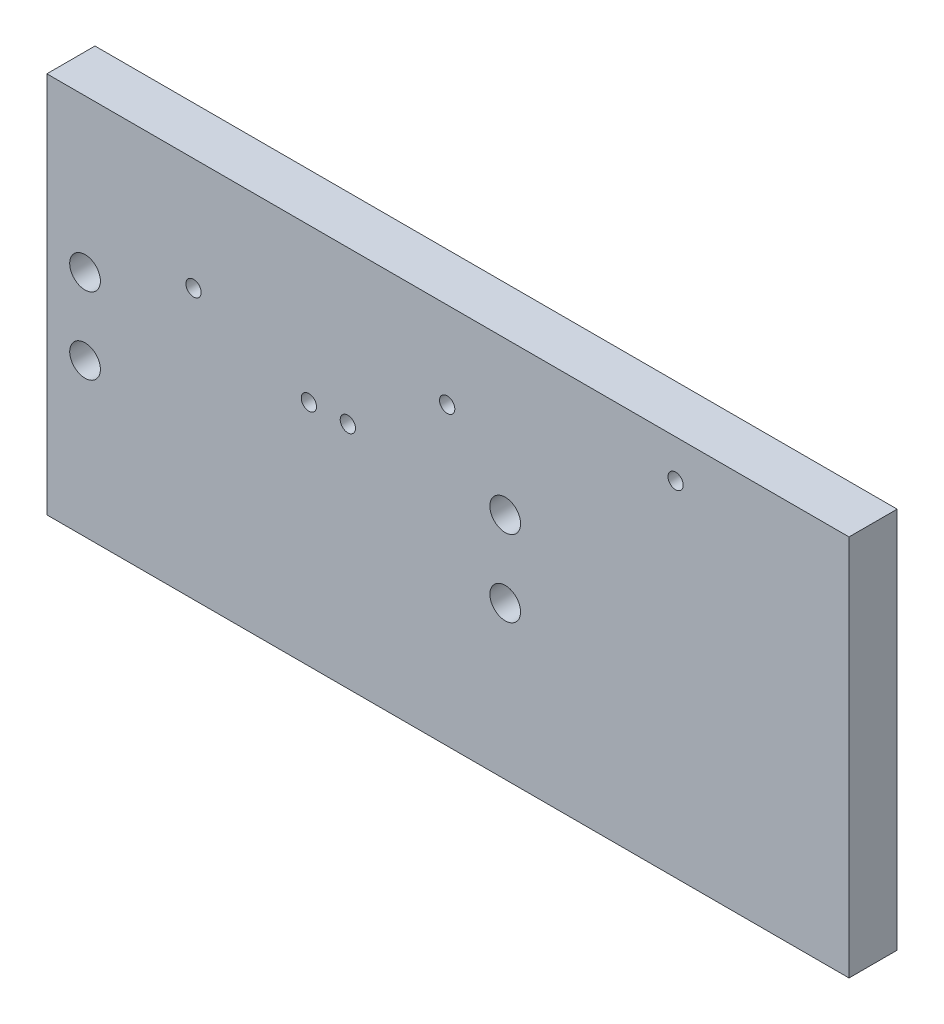
ISO-10303-21;
HEADER;
FILE_DESCRIPTION(('STEP AP214'),'2;1');
FILE_NAME('part.step','',(''),(''),'','','');
FILE_SCHEMA(('AUTOMOTIVE_DESIGN { 1 0 10303 214 1 1 1 1 }'));
ENDSEC;
DATA;
#1=APPLICATION_CONTEXT('core data for automotive mechanical design processes');
#2=APPLICATION_PROTOCOL_DEFINITION('international standard','automotive_design',2000,#1);
#3=PRODUCT_CONTEXT('',#1,'mechanical');
#4=PRODUCT('Part','Part','',(#3));
#5=PRODUCT_RELATED_PRODUCT_CATEGORY('part','',(#4));
#6=PRODUCT_DEFINITION_FORMATION('','',#4);
#7=PRODUCT_DEFINITION_CONTEXT('part definition',#1,'design');
#8=PRODUCT_DEFINITION('design','',#6,#7);
#9=PRODUCT_DEFINITION_SHAPE('','',#8);
#10=(LENGTH_UNIT() NAMED_UNIT(*) SI_UNIT(.MILLI.,.METRE.));
#11=(NAMED_UNIT(*) PLANE_ANGLE_UNIT() SI_UNIT($,.RADIAN.));
#12=(NAMED_UNIT(*) SI_UNIT($,.STERADIAN.) SOLID_ANGLE_UNIT());
#13=UNCERTAINTY_MEASURE_WITH_UNIT(LENGTH_MEASURE(1.E-05),#10,'distance_accuracy_value','');
#14=(GEOMETRIC_REPRESENTATION_CONTEXT(3) GLOBAL_UNCERTAINTY_ASSIGNED_CONTEXT((#13)) GLOBAL_UNIT_ASSIGNED_CONTEXT((#10,
#11,#12)) REPRESENTATION_CONTEXT('',''));
#15=CARTESIAN_POINT('',(0.,0.,0.));
#16=DIRECTION('',(0.,0.,1.));
#17=DIRECTION('',(1.,0.,0.));
#18=AXIS2_PLACEMENT_3D('',#15,#16,#17);
#19=CARTESIAN_POINT('',(0.,0.,1.6));
#20=DIRECTION('',(0.,0.,1.));
#21=DIRECTION('',(1.,0.,0.));
#22=AXIS2_PLACEMENT_3D('',#19,#20,#21);
#23=PLANE('',#22);
#24=CARTESIAN_POINT('',(15.24,7.62,1.6));
#25=DIRECTION('',(0.,0.,1.));
#26=DIRECTION('',(1.,0.,0.));
#27=AXIS2_PLACEMENT_3D('',#24,#25,#26);
#28=CIRCLE('',#27,0.51);
#29=CARTESIAN_POINT('',(15.75,7.62,1.6));
#30=VERTEX_POINT('',#29);
#31=EDGE_CURVE('E150',#30,#30,#28,.T.);
#32=ORIENTED_EDGE('',*,*,#31,.F.);
#33=EDGE_LOOP('',(#32));
#34=FACE_BOUND('',#33,.T.);
#35=CARTESIAN_POINT('',(1.27,7.62,1.6));
#36=DIRECTION('',(0.,0.,1.));
#37=DIRECTION('',(1.,0.,0.));
#38=AXIS2_PLACEMENT_3D('',#35,#36,#37);
#39=CIRCLE('',#38,0.51);
#40=CARTESIAN_POINT('',(1.78,7.62,1.6));
#41=VERTEX_POINT('',#40);
#42=EDGE_CURVE('E138',#41,#41,#39,.T.);
#43=ORIENTED_EDGE('',*,*,#42,.F.);
#44=EDGE_LOOP('',(#43));
#45=FACE_BOUND('',#44,.T.);
#46=CARTESIAN_POINT('',(20.9042,11.43,1.6));
#47=DIRECTION('',(0.,0.,1.));
#48=DIRECTION('',(1.,0.,0.));
#49=AXIS2_PLACEMENT_3D('',#46,#47,#48);
#50=CIRCLE('',#49,0.254000000000001);
#51=CARTESIAN_POINT('',(21.1582,11.43,1.6));
#52=VERTEX_POINT('',#51);
#53=EDGE_CURVE('E126',#52,#52,#50,.T.);
#54=ORIENTED_EDGE('',*,*,#53,.F.);
#55=EDGE_LOOP('',(#54));
#56=FACE_BOUND('',#55,.T.);
#57=CARTESIAN_POINT('',(10.0076,7.62,1.6));
#58=DIRECTION('',(0.,0.,1.));
#59=DIRECTION('',(1.,0.,0.));
#60=AXIS2_PLACEMENT_3D('',#57,#58,#59);
#61=CIRCLE('',#60,0.254000000000001);
#62=CARTESIAN_POINT('',(10.2616,7.62,1.6));
#63=VERTEX_POINT('',#62);
#64=EDGE_CURVE('E114',#63,#63,#61,.T.);
#65=ORIENTED_EDGE('',*,*,#64,.F.);
#66=EDGE_LOOP('',(#65));
#67=FACE_BOUND('',#66,.T.);
#68=DIRECTION('',(0.,-1.,0.));
#69=VECTOR('',#68,1.);
#70=CARTESIAN_POINT('',(0.,12.7,1.6));
#71=LINE('',#70,#69);
#72=CARTESIAN_POINT('',(0.,12.7,1.6));
#73=VERTEX_POINT('',#72);
#74=CARTESIAN_POINT('',(0.,0.,1.6));
#75=VERTEX_POINT('',#74);
#76=EDGE_CURVE('E84',#73,#75,#71,.T.);
#77=ORIENTED_EDGE('',*,*,#76,.T.);
#78=DIRECTION('',(1.,0.,0.));
#79=VECTOR('',#78,1.);
#80=CARTESIAN_POINT('',(0.,0.,1.6));
#81=LINE('',#80,#79);
#82=CARTESIAN_POINT('',(26.67,0.,1.6));
#83=VERTEX_POINT('',#82);
#84=EDGE_CURVE('E79',#75,#83,#81,.T.);
#85=ORIENTED_EDGE('',*,*,#84,.T.);
#86=DIRECTION('',(0.,1.,0.));
#87=VECTOR('',#86,1.);
#88=CARTESIAN_POINT('',(26.67,0.,1.6));
#89=LINE('',#88,#87);
#90=CARTESIAN_POINT('',(26.67,12.7,1.6));
#91=VERTEX_POINT('',#90);
#92=EDGE_CURVE('E82',#83,#91,#89,.T.);
#93=ORIENTED_EDGE('',*,*,#92,.T.);
#94=DIRECTION('',(-1.,0.,0.));
#95=VECTOR('',#94,1.);
#96=CARTESIAN_POINT('',(26.67,12.7,1.6));
#97=LINE('',#96,#95);
#98=EDGE_CURVE('E49',#91,#73,#97,.T.);
#99=ORIENTED_EDGE('',*,*,#98,.T.);
#100=EDGE_LOOP('',(#77,#85,#93,#99));
#101=FACE_BOUND('',#100,.T.);
#102=CARTESIAN_POINT('',(8.7122,7.5946,1.6));
#103=DIRECTION('',(0.,0.,1.));
#104=DIRECTION('',(1.,0.,0.));
#105=AXIS2_PLACEMENT_3D('',#102,#103,#104);
#106=CIRCLE('',#105,0.254000000000001);
#107=CARTESIAN_POINT('',(8.9662,7.5946,1.6));
#108=VERTEX_POINT('',#107);
#109=EDGE_CURVE('E99',#108,#108,#106,.T.);
#110=ORIENTED_EDGE('',*,*,#109,.F.);
#111=EDGE_LOOP('',(#110));
#112=FACE_BOUND('',#111,.T.);
#113=CARTESIAN_POINT('',(13.3096,9.8298,1.6));
#114=DIRECTION('',(0.,0.,1.));
#115=DIRECTION('',(1.,0.,0.));
#116=AXIS2_PLACEMENT_3D('',#113,#114,#115);
#117=CIRCLE('',#116,0.254000000000001);
#118=CARTESIAN_POINT('',(13.5636,9.8298,1.6));
#119=VERTEX_POINT('',#118);
#120=EDGE_CURVE('E120',#119,#119,#117,.T.);
#121=ORIENTED_EDGE('',*,*,#120,.F.);
#122=EDGE_LOOP('',(#121));
#123=FACE_BOUND('',#122,.T.);
#124=CARTESIAN_POINT('',(4.8768,8.9662,1.6));
#125=DIRECTION('',(0.,0.,1.));
#126=DIRECTION('',(1.,0.,0.));
#127=AXIS2_PLACEMENT_3D('',#124,#125,#126);
#128=CIRCLE('',#127,0.254);
#129=CARTESIAN_POINT('',(5.1308,8.9662,1.6));
#130=VERTEX_POINT('',#129);
#131=EDGE_CURVE('E132',#130,#130,#128,.T.);
#132=ORIENTED_EDGE('',*,*,#131,.F.);
#133=EDGE_LOOP('',(#132));
#134=FACE_BOUND('',#133,.T.);
#135=CARTESIAN_POINT('',(1.27,5.08,1.6));
#136=DIRECTION('',(0.,0.,1.));
#137=DIRECTION('',(1.,0.,0.));
#138=AXIS2_PLACEMENT_3D('',#135,#136,#137);
#139=CIRCLE('',#138,0.51);
#140=CARTESIAN_POINT('',(1.78,5.08,1.6));
#141=VERTEX_POINT('',#140);
#142=EDGE_CURVE('E144',#141,#141,#139,.T.);
#143=ORIENTED_EDGE('',*,*,#142,.F.);
#144=EDGE_LOOP('',(#143));
#145=FACE_BOUND('',#144,.T.);
#146=CARTESIAN_POINT('',(15.24,5.08,1.6));
#147=DIRECTION('',(0.,0.,1.));
#148=DIRECTION('',(1.,0.,0.));
#149=AXIS2_PLACEMENT_3D('',#146,#147,#148);
#150=CIRCLE('',#149,0.51);
#151=CARTESIAN_POINT('',(15.75,5.08,1.6));
#152=VERTEX_POINT('',#151);
#153=EDGE_CURVE('E156',#152,#152,#150,.T.);
#154=ORIENTED_EDGE('',*,*,#153,.F.);
#155=EDGE_LOOP('',(#154));
#156=FACE_BOUND('',#155,.T.);
#157=ADVANCED_FACE('F32',(#34,#45,#56,#67,#101,#112,#123,#134,#145,#156),#23,.T.);
#158=CARTESIAN_POINT('',(0.,0.,0.));
#159=DIRECTION('',(0.,0.,1.));
#160=DIRECTION('',(1.,0.,0.));
#161=AXIS2_PLACEMENT_3D('',#158,#159,#160);
#162=PLANE('',#161);
#163=CARTESIAN_POINT('',(15.24,7.62,0.));
#164=DIRECTION('',(0.,0.,1.));
#165=DIRECTION('',(1.,0.,0.));
#166=AXIS2_PLACEMENT_3D('',#163,#164,#165);
#167=CIRCLE('',#166,0.51);
#168=CARTESIAN_POINT('',(15.75,7.62,0.));
#169=VERTEX_POINT('',#168);
#170=EDGE_CURVE('E153',#169,#169,#167,.T.);
#171=ORIENTED_EDGE('',*,*,#170,.T.);
#172=EDGE_LOOP('',(#171));
#173=FACE_BOUND('',#172,.T.);
#174=CARTESIAN_POINT('',(1.27,7.62,0.));
#175=DIRECTION('',(0.,0.,1.));
#176=DIRECTION('',(1.,0.,0.));
#177=AXIS2_PLACEMENT_3D('',#174,#175,#176);
#178=CIRCLE('',#177,0.51);
#179=CARTESIAN_POINT('',(1.78,7.62,0.));
#180=VERTEX_POINT('',#179);
#181=EDGE_CURVE('E141',#180,#180,#178,.T.);
#182=ORIENTED_EDGE('',*,*,#181,.T.);
#183=EDGE_LOOP('',(#182));
#184=FACE_BOUND('',#183,.T.);
#185=CARTESIAN_POINT('',(20.9042,11.43,0.));
#186=DIRECTION('',(0.,0.,1.));
#187=DIRECTION('',(1.,0.,0.));
#188=AXIS2_PLACEMENT_3D('',#185,#186,#187);
#189=CIRCLE('',#188,0.254000000000001);
#190=CARTESIAN_POINT('',(21.1582,11.43,0.));
#191=VERTEX_POINT('',#190);
#192=EDGE_CURVE('E129',#191,#191,#189,.T.);
#193=ORIENTED_EDGE('',*,*,#192,.T.);
#194=EDGE_LOOP('',(#193));
#195=FACE_BOUND('',#194,.T.);
#196=CARTESIAN_POINT('',(10.0076,7.62,0.));
#197=DIRECTION('',(0.,0.,1.));
#198=DIRECTION('',(1.,0.,0.));
#199=AXIS2_PLACEMENT_3D('',#196,#197,#198);
#200=CIRCLE('',#199,0.254000000000001);
#201=CARTESIAN_POINT('',(10.2616,7.62,0.));
#202=VERTEX_POINT('',#201);
#203=EDGE_CURVE('E117',#202,#202,#200,.T.);
#204=ORIENTED_EDGE('',*,*,#203,.T.);
#205=EDGE_LOOP('',(#204));
#206=FACE_BOUND('',#205,.T.);
#207=DIRECTION('',(0.,-1.,0.));
#208=VECTOR('',#207,1.);
#209=CARTESIAN_POINT('',(0.,12.7,0.));
#210=LINE('',#209,#208);
#211=CARTESIAN_POINT('',(0.,12.7,0.));
#212=VERTEX_POINT('',#211);
#213=CARTESIAN_POINT('',(0.,0.,0.));
#214=VERTEX_POINT('',#213);
#215=EDGE_CURVE('E96',#212,#214,#210,.T.);
#216=ORIENTED_EDGE('',*,*,#215,.F.);
#217=DIRECTION('',(-1.,0.,0.));
#218=VECTOR('',#217,1.);
#219=CARTESIAN_POINT('',(26.67,12.7,0.));
#220=LINE('',#219,#218);
#221=CARTESIAN_POINT('',(26.67,12.7,0.));
#222=VERTEX_POINT('',#221);
#223=EDGE_CURVE('E72',#222,#212,#220,.T.);
#224=ORIENTED_EDGE('',*,*,#223,.F.);
#225=DIRECTION('',(0.,1.,0.));
#226=VECTOR('',#225,1.);
#227=CARTESIAN_POINT('',(26.67,0.,0.));
#228=LINE('',#227,#226);
#229=CARTESIAN_POINT('',(26.67,0.,0.));
#230=VERTEX_POINT('',#229);
#231=EDGE_CURVE('E66',#230,#222,#228,.T.);
#232=ORIENTED_EDGE('',*,*,#231,.F.);
#233=DIRECTION('',(1.,0.,0.));
#234=VECTOR('',#233,1.);
#235=CARTESIAN_POINT('',(0.,0.,0.));
#236=LINE('',#235,#234);
#237=EDGE_CURVE('E88',#214,#230,#236,.T.);
#238=ORIENTED_EDGE('',*,*,#237,.F.);
#239=EDGE_LOOP('',(#216,#224,#232,#238));
#240=FACE_BOUND('',#239,.T.);
#241=CARTESIAN_POINT('',(8.7122,7.5946,0.));
#242=DIRECTION('',(0.,0.,1.));
#243=DIRECTION('',(1.,0.,0.));
#244=AXIS2_PLACEMENT_3D('',#241,#242,#243);
#245=CIRCLE('',#244,0.254000000000001);
#246=CARTESIAN_POINT('',(8.9662,7.5946,0.));
#247=VERTEX_POINT('',#246);
#248=EDGE_CURVE('E111',#247,#247,#245,.T.);
#249=ORIENTED_EDGE('',*,*,#248,.T.);
#250=EDGE_LOOP('',(#249));
#251=FACE_BOUND('',#250,.T.);
#252=CARTESIAN_POINT('',(13.3096,9.8298,0.));
#253=DIRECTION('',(0.,0.,1.));
#254=DIRECTION('',(1.,0.,0.));
#255=AXIS2_PLACEMENT_3D('',#252,#253,#254);
#256=CIRCLE('',#255,0.254000000000001);
#257=CARTESIAN_POINT('',(13.5636,9.8298,0.));
#258=VERTEX_POINT('',#257);
#259=EDGE_CURVE('E123',#258,#258,#256,.T.);
#260=ORIENTED_EDGE('',*,*,#259,.T.);
#261=EDGE_LOOP('',(#260));
#262=FACE_BOUND('',#261,.T.);
#263=CARTESIAN_POINT('',(4.8768,8.9662,0.));
#264=DIRECTION('',(0.,0.,1.));
#265=DIRECTION('',(1.,0.,0.));
#266=AXIS2_PLACEMENT_3D('',#263,#264,#265);
#267=CIRCLE('',#266,0.254);
#268=CARTESIAN_POINT('',(5.1308,8.9662,0.));
#269=VERTEX_POINT('',#268);
#270=EDGE_CURVE('E135',#269,#269,#267,.T.);
#271=ORIENTED_EDGE('',*,*,#270,.T.);
#272=EDGE_LOOP('',(#271));
#273=FACE_BOUND('',#272,.T.);
#274=CARTESIAN_POINT('',(1.27,5.08,0.));
#275=DIRECTION('',(0.,0.,1.));
#276=DIRECTION('',(1.,0.,0.));
#277=AXIS2_PLACEMENT_3D('',#274,#275,#276);
#278=CIRCLE('',#277,0.51);
#279=CARTESIAN_POINT('',(1.78,5.08,0.));
#280=VERTEX_POINT('',#279);
#281=EDGE_CURVE('E147',#280,#280,#278,.T.);
#282=ORIENTED_EDGE('',*,*,#281,.T.);
#283=EDGE_LOOP('',(#282));
#284=FACE_BOUND('',#283,.T.);
#285=CARTESIAN_POINT('',(15.24,5.08,0.));
#286=DIRECTION('',(0.,0.,1.));
#287=DIRECTION('',(1.,0.,0.));
#288=AXIS2_PLACEMENT_3D('',#285,#286,#287);
#289=CIRCLE('',#288,0.51);
#290=CARTESIAN_POINT('',(15.75,5.08,0.));
#291=VERTEX_POINT('',#290);
#292=EDGE_CURVE('E159',#291,#291,#289,.T.);
#293=ORIENTED_EDGE('',*,*,#292,.T.);
#294=EDGE_LOOP('',(#293));
#295=FACE_BOUND('',#294,.T.);
#296=ADVANCED_FACE('F107',(#173,#184,#195,#206,#240,#251,#262,#273,#284,#295),#162,.F.);
#297=CARTESIAN_POINT('',(0.,12.7,1.6));
#298=DIRECTION('',(1.,0.,0.));
#299=DIRECTION('',(0.,0.,-1.));
#300=AXIS2_PLACEMENT_3D('',#297,#298,#299);
#301=PLANE('',#300);
#302=ORIENTED_EDGE('',*,*,#215,.T.);
#303=DIRECTION('',(0.,0.,-1.));
#304=VECTOR('',#303,1.);
#305=CARTESIAN_POINT('',(0.,0.,1.6));
#306=LINE('',#305,#304);
#307=EDGE_CURVE('E11',#75,#214,#306,.T.);
#308=ORIENTED_EDGE('',*,*,#307,.F.);
#309=ORIENTED_EDGE('',*,*,#76,.F.);
#310=DIRECTION('',(0.,0.,-1.));
#311=VECTOR('',#310,1.);
#312=CARTESIAN_POINT('',(0.,12.7,1.6));
#313=LINE('',#312,#311);
#314=EDGE_CURVE('E92',#73,#212,#313,.T.);
#315=ORIENTED_EDGE('',*,*,#314,.T.);
#316=EDGE_LOOP('',(#302,#308,#309,#315));
#317=FACE_BOUND('',#316,.T.);
#318=ADVANCED_FACE('F34',(#317),#301,.F.);
#319=CARTESIAN_POINT('',(0.,0.,1.6));
#320=DIRECTION('',(0.,1.,0.));
#321=DIRECTION('',(0.,0.,1.));
#322=AXIS2_PLACEMENT_3D('',#319,#320,#321);
#323=PLANE('',#322);
#324=ORIENTED_EDGE('',*,*,#237,.T.);
#325=DIRECTION('',(0.,0.,-1.));
#326=VECTOR('',#325,1.);
#327=CARTESIAN_POINT('',(26.67,0.,1.6));
#328=LINE('',#327,#326);
#329=EDGE_CURVE('E41',#83,#230,#328,.T.);
#330=ORIENTED_EDGE('',*,*,#329,.F.);
#331=ORIENTED_EDGE('',*,*,#84,.F.);
#332=ORIENTED_EDGE('',*,*,#307,.T.);
#333=EDGE_LOOP('',(#324,#330,#331,#332));
#334=FACE_BOUND('',#333,.T.);
#335=ADVANCED_FACE('F87',(#334),#323,.F.);
#336=CARTESIAN_POINT('',(26.67,0.,1.6));
#337=DIRECTION('',(-1.,0.,0.));
#338=DIRECTION('',(0.,0.,1.));
#339=AXIS2_PLACEMENT_3D('',#336,#337,#338);
#340=PLANE('',#339);
#341=ORIENTED_EDGE('',*,*,#231,.T.);
#342=DIRECTION('',(0.,0.,-1.));
#343=VECTOR('',#342,1.);
#344=CARTESIAN_POINT('',(26.67,12.7,1.6));
#345=LINE('',#344,#343);
#346=EDGE_CURVE('E89',#91,#222,#345,.T.);
#347=ORIENTED_EDGE('',*,*,#346,.F.);
#348=ORIENTED_EDGE('',*,*,#92,.F.);
#349=ORIENTED_EDGE('',*,*,#329,.T.);
#350=EDGE_LOOP('',(#341,#347,#348,#349));
#351=FACE_BOUND('',#350,.T.);
#352=ADVANCED_FACE('F90',(#351),#340,.F.);
#353=CARTESIAN_POINT('',(26.67,12.7,1.6));
#354=DIRECTION('',(0.,-1.,0.));
#355=DIRECTION('',(0.,0.,-1.));
#356=AXIS2_PLACEMENT_3D('',#353,#354,#355);
#357=PLANE('',#356);
#358=ORIENTED_EDGE('',*,*,#223,.T.);
#359=ORIENTED_EDGE('',*,*,#314,.F.);
#360=ORIENTED_EDGE('',*,*,#98,.F.);
#361=ORIENTED_EDGE('',*,*,#346,.T.);
#362=EDGE_LOOP('',(#358,#359,#360,#361));
#363=FACE_BOUND('',#362,.T.);
#364=ADVANCED_FACE('F104',(#363),#357,.F.);
#365=CARTESIAN_POINT('',(8.7122,7.5946,1.6));
#366=DIRECTION('',(0.,0.,-1.));
#367=DIRECTION('',(-1.,0.,0.));
#368=AXIS2_PLACEMENT_3D('',#365,#366,#367);
#369=CYLINDRICAL_SURFACE('',#368,0.254000000000001);
#370=ORIENTED_EDGE('',*,*,#109,.T.);
#371=EDGE_LOOP('',(#370));
#372=FACE_BOUND('',#371,.T.);
#373=ORIENTED_EDGE('',*,*,#248,.F.);
#374=EDGE_LOOP('',(#373));
#375=FACE_BOUND('',#374,.T.);
#376=ADVANCED_FACE('F179',(#372,#375),#369,.F.);
#377=CARTESIAN_POINT('',(10.0076,7.62,1.6));
#378=DIRECTION('',(0.,0.,-1.));
#379=DIRECTION('',(-1.,0.,0.));
#380=AXIS2_PLACEMENT_3D('',#377,#378,#379);
#381=CYLINDRICAL_SURFACE('',#380,0.254000000000001);
#382=ORIENTED_EDGE('',*,*,#64,.T.);
#383=EDGE_LOOP('',(#382));
#384=FACE_BOUND('',#383,.T.);
#385=ORIENTED_EDGE('',*,*,#203,.F.);
#386=EDGE_LOOP('',(#385));
#387=FACE_BOUND('',#386,.T.);
#388=ADVANCED_FACE('F252',(#384,#387),#381,.F.);
#389=CARTESIAN_POINT('',(13.3096,9.8298,1.6));
#390=DIRECTION('',(0.,0.,-1.));
#391=DIRECTION('',(-1.,0.,0.));
#392=AXIS2_PLACEMENT_3D('',#389,#390,#391);
#393=CYLINDRICAL_SURFACE('',#392,0.254000000000001);
#394=ORIENTED_EDGE('',*,*,#120,.T.);
#395=EDGE_LOOP('',(#394));
#396=FACE_BOUND('',#395,.T.);
#397=ORIENTED_EDGE('',*,*,#259,.F.);
#398=EDGE_LOOP('',(#397));
#399=FACE_BOUND('',#398,.T.);
#400=ADVANCED_FACE('F249',(#396,#399),#393,.F.);
#401=CARTESIAN_POINT('',(20.9042,11.43,1.6));
#402=DIRECTION('',(0.,0.,-1.));
#403=DIRECTION('',(-1.,0.,0.));
#404=AXIS2_PLACEMENT_3D('',#401,#402,#403);
#405=CYLINDRICAL_SURFACE('',#404,0.254000000000001);
#406=ORIENTED_EDGE('',*,*,#53,.T.);
#407=EDGE_LOOP('',(#406));
#408=FACE_BOUND('',#407,.T.);
#409=ORIENTED_EDGE('',*,*,#192,.F.);
#410=EDGE_LOOP('',(#409));
#411=FACE_BOUND('',#410,.T.);
#412=ADVANCED_FACE('F245',(#408,#411),#405,.F.);
#413=CARTESIAN_POINT('',(4.8768,8.9662,1.6));
#414=DIRECTION('',(0.,0.,-1.));
#415=DIRECTION('',(-1.,0.,0.));
#416=AXIS2_PLACEMENT_3D('',#413,#414,#415);
#417=CYLINDRICAL_SURFACE('',#416,0.254);
#418=ORIENTED_EDGE('',*,*,#131,.T.);
#419=EDGE_LOOP('',(#418));
#420=FACE_BOUND('',#419,.T.);
#421=ORIENTED_EDGE('',*,*,#270,.F.);
#422=EDGE_LOOP('',(#421));
#423=FACE_BOUND('',#422,.T.);
#424=ADVANCED_FACE('F210',(#420,#423),#417,.F.);
#425=CARTESIAN_POINT('',(1.27,7.62,1.6));
#426=DIRECTION('',(0.,0.,-1.));
#427=DIRECTION('',(-1.,0.,0.));
#428=AXIS2_PLACEMENT_3D('',#425,#426,#427);
#429=CYLINDRICAL_SURFACE('',#428,0.51);
#430=ORIENTED_EDGE('',*,*,#42,.T.);
#431=EDGE_LOOP('',(#430));
#432=FACE_BOUND('',#431,.T.);
#433=ORIENTED_EDGE('',*,*,#181,.F.);
#434=EDGE_LOOP('',(#433));
#435=FACE_BOUND('',#434,.T.);
#436=ADVANCED_FACE('F204',(#432,#435),#429,.F.);
#437=CARTESIAN_POINT('',(1.27,5.08,1.6));
#438=DIRECTION('',(0.,0.,-1.));
#439=DIRECTION('',(-1.,0.,0.));
#440=AXIS2_PLACEMENT_3D('',#437,#438,#439);
#441=CYLINDRICAL_SURFACE('',#440,0.51);
#442=ORIENTED_EDGE('',*,*,#142,.T.);
#443=EDGE_LOOP('',(#442));
#444=FACE_BOUND('',#443,.T.);
#445=ORIENTED_EDGE('',*,*,#281,.F.);
#446=EDGE_LOOP('',(#445));
#447=FACE_BOUND('',#446,.T.);
#448=ADVANCED_FACE('F209',(#444,#447),#441,.F.);
#449=CARTESIAN_POINT('',(15.24,7.62,1.6));
#450=DIRECTION('',(0.,0.,-1.));
#451=DIRECTION('',(-1.,0.,0.));
#452=AXIS2_PLACEMENT_3D('',#449,#450,#451);
#453=CYLINDRICAL_SURFACE('',#452,0.51);
#454=ORIENTED_EDGE('',*,*,#31,.T.);
#455=EDGE_LOOP('',(#454));
#456=FACE_BOUND('',#455,.T.);
#457=ORIENTED_EDGE('',*,*,#170,.F.);
#458=EDGE_LOOP('',(#457));
#459=FACE_BOUND('',#458,.T.);
#460=ADVANCED_FACE('F221',(#456,#459),#453,.F.);
#461=CARTESIAN_POINT('',(15.24,5.08,1.6));
#462=DIRECTION('',(0.,0.,-1.));
#463=DIRECTION('',(-1.,0.,0.));
#464=AXIS2_PLACEMENT_3D('',#461,#462,#463);
#465=CYLINDRICAL_SURFACE('',#464,0.51);
#466=ORIENTED_EDGE('',*,*,#153,.T.);
#467=EDGE_LOOP('',(#466));
#468=FACE_BOUND('',#467,.T.);
#469=ORIENTED_EDGE('',*,*,#292,.F.);
#470=EDGE_LOOP('',(#469));
#471=FACE_BOUND('',#470,.T.);
#472=ADVANCED_FACE('F165',(#468,#471),#465,.F.);
#473=CLOSED_SHELL('',(#157,#296,#318,#335,#352,#364,#376,#388,#400,#412,#424,#436,#448,#460,#472));
#474=MANIFOLD_SOLID_BREP('B2',#473);
#475=ADVANCED_BREP_SHAPE_REPRESENTATION('',(#18,#474),#14);
#476=SHAPE_DEFINITION_REPRESENTATION(#9,#475);
ENDSEC;
END-ISO-10303-21;
